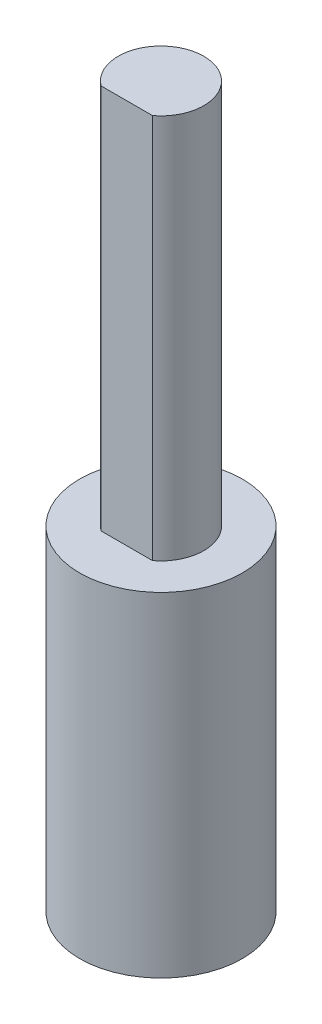
ISO-10303-21;
HEADER;
FILE_DESCRIPTION(('STEP AP214'),'2;1');
FILE_NAME('part.step','',(''),(''),'','','');
FILE_SCHEMA(('AUTOMOTIVE_DESIGN { 1 0 10303 214 1 1 1 1 }'));
ENDSEC;
DATA;
#1=APPLICATION_CONTEXT('core data for automotive mechanical design processes');
#2=APPLICATION_PROTOCOL_DEFINITION('international standard','automotive_design',2000,#1);
#3=PRODUCT_CONTEXT('',#1,'mechanical');
#4=PRODUCT('Part','Part','',(#3));
#5=PRODUCT_RELATED_PRODUCT_CATEGORY('part','',(#4));
#6=PRODUCT_DEFINITION_FORMATION('','',#4);
#7=PRODUCT_DEFINITION_CONTEXT('part definition',#1,'design');
#8=PRODUCT_DEFINITION('design','',#6,#7);
#9=PRODUCT_DEFINITION_SHAPE('','',#8);
#10=(LENGTH_UNIT() NAMED_UNIT(*) SI_UNIT(.MILLI.,.METRE.));
#11=(NAMED_UNIT(*) PLANE_ANGLE_UNIT() SI_UNIT($,.RADIAN.));
#12=(NAMED_UNIT(*) SI_UNIT($,.STERADIAN.) SOLID_ANGLE_UNIT());
#13=UNCERTAINTY_MEASURE_WITH_UNIT(LENGTH_MEASURE(1.E-05),#10,'distance_accuracy_value','');
#14=(GEOMETRIC_REPRESENTATION_CONTEXT(3) GLOBAL_UNCERTAINTY_ASSIGNED_CONTEXT((#13)) GLOBAL_UNIT_ASSIGNED_CONTEXT((#10,
#11,#12)) REPRESENTATION_CONTEXT('',''));
#15=CARTESIAN_POINT('',(0.,0.,0.));
#16=DIRECTION('',(0.,0.,1.));
#17=DIRECTION('',(1.,0.,0.));
#18=AXIS2_PLACEMENT_3D('',#15,#16,#17);
#19=CARTESIAN_POINT('',(0.,19.5,0.));
#20=DIRECTION('',(0.,-1.,0.));
#21=DIRECTION('',(0.,0.,-1.));
#22=AXIS2_PLACEMENT_3D('',#19,#20,#21);
#23=CYLINDRICAL_SURFACE('',#22,4.75);
#24=CARTESIAN_POINT('',(0.,19.5,0.));
#25=DIRECTION('',(0.,1.,0.));
#26=DIRECTION('',(0.,0.,1.));
#27=AXIS2_PLACEMENT_3D('',#24,#25,#26);
#28=CIRCLE('',#27,4.75);
#29=CARTESIAN_POINT('',(0.,19.5,4.75));
#30=VERTEX_POINT('',#29);
#31=EDGE_CURVE('E11',#30,#30,#28,.T.);
#32=ORIENTED_EDGE('',*,*,#31,.F.);
#33=EDGE_LOOP('',(#32));
#34=FACE_BOUND('',#33,.T.);
#35=CARTESIAN_POINT('',(0.,0.,0.));
#36=DIRECTION('',(0.,1.,0.));
#37=DIRECTION('',(0.,0.,1.));
#38=AXIS2_PLACEMENT_3D('',#35,#36,#37);
#39=CIRCLE('',#38,4.75);
#40=CARTESIAN_POINT('',(0.,0.,4.75));
#41=VERTEX_POINT('',#40);
#42=EDGE_CURVE('E48',#41,#41,#39,.T.);
#43=ORIENTED_EDGE('',*,*,#42,.T.);
#44=EDGE_LOOP('',(#43));
#45=FACE_BOUND('',#44,.T.);
#46=ADVANCED_FACE('F45',(#34,#45),#23,.T.);
#47=CARTESIAN_POINT('',(0.,19.5,0.));
#48=DIRECTION('',(0.,1.,0.));
#49=DIRECTION('',(0.,0.,1.));
#50=AXIS2_PLACEMENT_3D('',#47,#48,#49);
#51=PLANE('',#50);
#52=DIRECTION('',(1.,0.,0.));
#53=VECTOR('',#52,1.);
#54=CARTESIAN_POINT('',(0.,19.5,2.));
#55=LINE('',#54,#53);
#56=CARTESIAN_POINT('',(-1.5,19.5,2.));
#57=VERTEX_POINT('',#56);
#58=CARTESIAN_POINT('',(1.5,19.5,2.));
#59=VERTEX_POINT('',#58);
#60=EDGE_CURVE('E72',#57,#59,#55,.T.);
#61=ORIENTED_EDGE('',*,*,#60,.F.);
#62=CARTESIAN_POINT('',(0.,19.5,0.));
#63=DIRECTION('',(0.,1.,0.));
#64=DIRECTION('',(0.,0.,1.));
#65=AXIS2_PLACEMENT_3D('',#62,#63,#64);
#66=CIRCLE('',#65,2.5);
#67=EDGE_CURVE('E59',#59,#57,#66,.T.);
#68=ORIENTED_EDGE('',*,*,#67,.F.);
#69=EDGE_LOOP('',(#61,#68));
#70=FACE_BOUND('',#69,.T.);
#71=ORIENTED_EDGE('',*,*,#31,.T.);
#72=EDGE_LOOP('',(#71));
#73=FACE_BOUND('',#72,.T.);
#74=ADVANCED_FACE('F73',(#70,#73),#51,.T.);
#75=CARTESIAN_POINT('',(0.,0.,0.));
#76=DIRECTION('',(0.,1.,0.));
#77=DIRECTION('',(0.,0.,1.));
#78=AXIS2_PLACEMENT_3D('',#75,#76,#77);
#79=PLANE('',#78);
#80=ORIENTED_EDGE('',*,*,#42,.F.);
#81=EDGE_LOOP('',(#80));
#82=FACE_BOUND('',#81,.T.);
#83=ADVANCED_FACE('F109',(#82),#79,.F.);
#84=CARTESIAN_POINT('',(0.,42.,2.));
#85=DIRECTION('',(0.,0.,-1.));
#86=DIRECTION('',(-1.,0.,0.));
#87=AXIS2_PLACEMENT_3D('',#84,#85,#86);
#88=PLANE('',#87);
#89=ORIENTED_EDGE('',*,*,#60,.T.);
#90=DIRECTION('',(0.,-1.,0.));
#91=VECTOR('',#90,1.);
#92=CARTESIAN_POINT('',(1.5,42.,2.));
#93=LINE('',#92,#91);
#94=CARTESIAN_POINT('',(1.5,42.,2.));
#95=VERTEX_POINT('',#94);
#96=EDGE_CURVE('E84',#95,#59,#93,.T.);
#97=ORIENTED_EDGE('',*,*,#96,.F.);
#98=DIRECTION('',(1.,0.,0.));
#99=VECTOR('',#98,1.);
#100=CARTESIAN_POINT('',(0.,42.,2.));
#101=LINE('',#100,#99);
#102=CARTESIAN_POINT('',(-1.5,42.,2.));
#103=VERTEX_POINT('',#102);
#104=EDGE_CURVE('E86',#103,#95,#101,.T.);
#105=ORIENTED_EDGE('',*,*,#104,.F.);
#106=DIRECTION('',(0.,-1.,0.));
#107=VECTOR('',#106,1.);
#108=CARTESIAN_POINT('',(-1.5,42.,2.));
#109=LINE('',#108,#107);
#110=EDGE_CURVE('E82',#103,#57,#109,.T.);
#111=ORIENTED_EDGE('',*,*,#110,.T.);
#112=EDGE_LOOP('',(#89,#97,#105,#111));
#113=FACE_BOUND('',#112,.T.);
#114=ADVANCED_FACE('F88',(#113),#88,.F.);
#115=CARTESIAN_POINT('',(0.,42.,0.));
#116=DIRECTION('',(0.,-1.,0.));
#117=DIRECTION('',(0.,0.,-1.));
#118=AXIS2_PLACEMENT_3D('',#115,#116,#117);
#119=CYLINDRICAL_SURFACE('',#118,2.5);
#120=ORIENTED_EDGE('',*,*,#67,.T.);
#121=ORIENTED_EDGE('',*,*,#110,.F.);
#122=CARTESIAN_POINT('',(0.,42.,0.));
#123=DIRECTION('',(0.,1.,0.));
#124=DIRECTION('',(0.,0.,1.));
#125=AXIS2_PLACEMENT_3D('',#122,#123,#124);
#126=CIRCLE('',#125,2.5);
#127=EDGE_CURVE('E67',#95,#103,#126,.T.);
#128=ORIENTED_EDGE('',*,*,#127,.F.);
#129=ORIENTED_EDGE('',*,*,#96,.T.);
#130=EDGE_LOOP('',(#120,#121,#128,#129));
#131=FACE_BOUND('',#130,.T.);
#132=ADVANCED_FACE('F81',(#131),#119,.T.);
#133=CARTESIAN_POINT('',(0.,42.,0.));
#134=DIRECTION('',(0.,1.,0.));
#135=DIRECTION('',(0.,0.,1.));
#136=AXIS2_PLACEMENT_3D('',#133,#134,#135);
#137=PLANE('',#136);
#138=ORIENTED_EDGE('',*,*,#104,.T.);
#139=ORIENTED_EDGE('',*,*,#127,.T.);
#140=EDGE_LOOP('',(#138,#139));
#141=FACE_BOUND('',#140,.T.);
#142=ADVANCED_FACE('F97',(#141),#137,.T.);
#143=CLOSED_SHELL('',(#46,#74,#83,#114,#132,#142));
#144=MANIFOLD_SOLID_BREP('B2',#143);
#145=ADVANCED_BREP_SHAPE_REPRESENTATION('',(#18,#144),#14);
#146=SHAPE_DEFINITION_REPRESENTATION(#9,#145);
ENDSEC;
END-ISO-10303-21;
